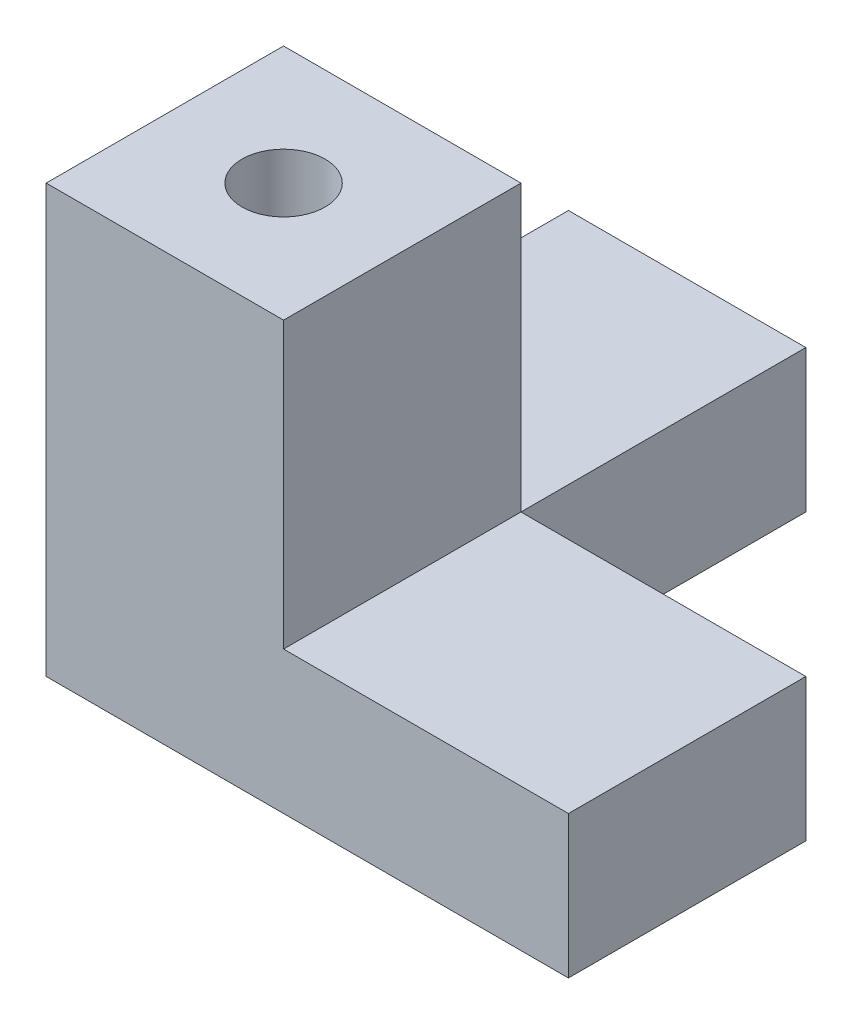
ISO-10303-21;
HEADER;
FILE_DESCRIPTION(('STEP AP214'),'2;1');
FILE_NAME('part.step','',(''),(''),'','','');
FILE_SCHEMA(('AUTOMOTIVE_DESIGN { 1 0 10303 214 1 1 1 1 }'));
ENDSEC;
DATA;
#1=APPLICATION_CONTEXT('core data for automotive mechanical design processes');
#2=APPLICATION_PROTOCOL_DEFINITION('international standard','automotive_design',2000,#1);
#3=PRODUCT_CONTEXT('',#1,'mechanical');
#4=PRODUCT('Part','Part','',(#3));
#5=PRODUCT_RELATED_PRODUCT_CATEGORY('part','',(#4));
#6=PRODUCT_DEFINITION_FORMATION('','',#4);
#7=PRODUCT_DEFINITION_CONTEXT('part definition',#1,'design');
#8=PRODUCT_DEFINITION('design','',#6,#7);
#9=PRODUCT_DEFINITION_SHAPE('','',#8);
#10=(LENGTH_UNIT() NAMED_UNIT(*) SI_UNIT(.MILLI.,.METRE.));
#11=(NAMED_UNIT(*) PLANE_ANGLE_UNIT() SI_UNIT($,.RADIAN.));
#12=(NAMED_UNIT(*) SI_UNIT($,.STERADIAN.) SOLID_ANGLE_UNIT());
#13=UNCERTAINTY_MEASURE_WITH_UNIT(LENGTH_MEASURE(1.E-05),#10,'distance_accuracy_value','');
#14=(GEOMETRIC_REPRESENTATION_CONTEXT(3) GLOBAL_UNCERTAINTY_ASSIGNED_CONTEXT((#13)) GLOBAL_UNIT_ASSIGNED_CONTEXT((#10,
#11,#12)) REPRESENTATION_CONTEXT('',''));
#15=CARTESIAN_POINT('',(0.,0.,0.));
#16=DIRECTION('',(0.,0.,1.));
#17=DIRECTION('',(1.,0.,0.));
#18=AXIS2_PLACEMENT_3D('',#15,#16,#17);
#19=CARTESIAN_POINT('',(5.,0.,-5.));
#20=DIRECTION('',(0.,1.,0.));
#21=DIRECTION('',(0.,0.,1.));
#22=AXIS2_PLACEMENT_3D('',#19,#20,#21);
#23=CYLINDRICAL_SURFACE('',#22,1.75);
#24=CARTESIAN_POINT('',(5.,18.,-5.));
#25=DIRECTION('',(0.,1.,0.));
#26=DIRECTION('',(0.,0.,1.));
#27=AXIS2_PLACEMENT_3D('',#24,#25,#26);
#28=CIRCLE('',#27,1.75);
#29=CARTESIAN_POINT('',(5.,18.,-3.25));
#30=VERTEX_POINT('',#29);
#31=EDGE_CURVE('E194',#30,#30,#28,.T.);
#32=ORIENTED_EDGE('',*,*,#31,.T.);
#33=EDGE_LOOP('',(#32));
#34=FACE_BOUND('',#33,.T.);
#35=CARTESIAN_POINT('',(5.,3.,-5.));
#36=DIRECTION('',(0.,-1.,0.));
#37=DIRECTION('',(0.,0.,-1.));
#38=AXIS2_PLACEMENT_3D('',#35,#36,#37);
#39=CIRCLE('',#38,1.75);
#40=CARTESIAN_POINT('',(5.,3.,-6.75));
#41=VERTEX_POINT('',#40);
#42=EDGE_CURVE('E37',#41,#41,#39,.F.);
#43=ORIENTED_EDGE('',*,*,#42,.F.);
#44=EDGE_LOOP('',(#43));
#45=FACE_BOUND('',#44,.T.);
#46=ADVANCED_FACE('F33',(#34,#45),#23,.F.);
#47=CARTESIAN_POINT('',(0.,6.,0.));
#48=DIRECTION('',(0.,-1.,0.));
#49=DIRECTION('',(0.,0.,-1.));
#50=AXIS2_PLACEMENT_3D('',#47,#48,#49);
#51=PLANE('',#50);
#52=DIRECTION('',(0.,0.,-1.));
#53=VECTOR('',#52,1.);
#54=CARTESIAN_POINT('',(10.,6.,-10.));
#55=LINE('',#54,#53);
#56=CARTESIAN_POINT('',(10.,6.,0.));
#57=VERTEX_POINT('',#56);
#58=CARTESIAN_POINT('',(10.,6.,-10.));
#59=VERTEX_POINT('',#58);
#60=EDGE_CURVE('E57',#57,#59,#55,.T.);
#61=ORIENTED_EDGE('',*,*,#60,.F.);
#62=DIRECTION('',(1.,0.,0.));
#63=VECTOR('',#62,1.);
#64=CARTESIAN_POINT('',(22.,6.,0.));
#65=LINE('',#64,#63);
#66=CARTESIAN_POINT('',(22.,6.,0.));
#67=VERTEX_POINT('',#66);
#68=EDGE_CURVE('E221',#57,#67,#65,.T.);
#69=ORIENTED_EDGE('',*,*,#68,.T.);
#70=DIRECTION('',(0.,0.,-1.));
#71=VECTOR('',#70,1.);
#72=CARTESIAN_POINT('',(22.,6.,-10.));
#73=LINE('',#72,#71);
#74=CARTESIAN_POINT('',(22.,6.,-10.));
#75=VERTEX_POINT('',#74);
#76=EDGE_CURVE('E223',#67,#75,#73,.T.);
#77=ORIENTED_EDGE('',*,*,#76,.T.);
#78=DIRECTION('',(-1.,0.,0.));
#79=VECTOR('',#78,1.);
#80=CARTESIAN_POINT('',(10.,6.,-10.));
#81=LINE('',#80,#79);
#82=EDGE_CURVE('E226',#75,#59,#81,.T.);
#83=ORIENTED_EDGE('',*,*,#82,.T.);
#84=EDGE_LOOP('',(#61,#69,#77,#83));
#85=FACE_BOUND('',#84,.T.);
#86=ADVANCED_FACE('F294',(#85),#51,.F.);
#87=DIRECTION('',(-1.,0.,0.));
#88=VECTOR('',#87,1.);
#89=CARTESIAN_POINT('',(10.,6.,-10.));
#90=LINE('',#89,#88);
#91=CARTESIAN_POINT('',(0.,6.,-10.));
#92=VERTEX_POINT('',#91);
#93=EDGE_CURVE('E201',#59,#92,#90,.T.);
#94=ORIENTED_EDGE('',*,*,#93,.F.);
#95=DIRECTION('',(0.,0.,-1.));
#96=VECTOR('',#95,1.);
#97=CARTESIAN_POINT('',(10.,6.,-22.));
#98=LINE('',#97,#96);
#99=CARTESIAN_POINT('',(10.,6.,-22.));
#100=VERTEX_POINT('',#99);
#101=EDGE_CURVE('E228',#59,#100,#98,.T.);
#102=ORIENTED_EDGE('',*,*,#101,.T.);
#103=DIRECTION('',(-1.,0.,0.));
#104=VECTOR('',#103,1.);
#105=CARTESIAN_POINT('',(0.,6.,-22.));
#106=LINE('',#105,#104);
#107=CARTESIAN_POINT('',(0.,6.,-22.));
#108=VERTEX_POINT('',#107);
#109=EDGE_CURVE('E230',#100,#108,#106,.T.);
#110=ORIENTED_EDGE('',*,*,#109,.T.);
#111=DIRECTION('',(0.,0.,1.));
#112=VECTOR('',#111,1.);
#113=CARTESIAN_POINT('',(0.,6.,0.));
#114=LINE('',#113,#112);
#115=EDGE_CURVE('E232',#108,#92,#114,.T.);
#116=ORIENTED_EDGE('',*,*,#115,.T.);
#117=EDGE_LOOP('',(#94,#102,#110,#116));
#118=FACE_BOUND('',#117,.T.);
#119=ADVANCED_FACE('F282',(#118),#51,.F.);
#120=CARTESIAN_POINT('',(22.,6.,0.));
#121=DIRECTION('',(0.,0.,-1.));
#122=DIRECTION('',(-1.,0.,0.));
#123=AXIS2_PLACEMENT_3D('',#120,#121,#122);
#124=PLANE('',#123);
#125=DIRECTION('',(1.,0.,0.));
#126=VECTOR('',#125,1.);
#127=CARTESIAN_POINT('',(22.,0.,0.));
#128=LINE('',#127,#126);
#129=CARTESIAN_POINT('',(0.,0.,0.));
#130=VERTEX_POINT('',#129);
#131=CARTESIAN_POINT('',(22.,0.,0.));
#132=VERTEX_POINT('',#131);
#133=EDGE_CURVE('E220',#130,#132,#128,.T.);
#134=ORIENTED_EDGE('',*,*,#133,.T.);
#135=DIRECTION('',(0.,-1.,0.));
#136=VECTOR('',#135,1.);
#137=CARTESIAN_POINT('',(22.,6.,0.));
#138=LINE('',#137,#136);
#139=EDGE_CURVE('E11',#67,#132,#138,.T.);
#140=ORIENTED_EDGE('',*,*,#139,.F.);
#141=ORIENTED_EDGE('',*,*,#68,.F.);
#142=DIRECTION('',(0.,-1.,0.));
#143=VECTOR('',#142,1.);
#144=CARTESIAN_POINT('',(10.,18.,0.));
#145=LINE('',#144,#143);
#146=CARTESIAN_POINT('',(10.,18.,0.));
#147=VERTEX_POINT('',#146);
#148=EDGE_CURVE('E208',#147,#57,#145,.T.);
#149=ORIENTED_EDGE('',*,*,#148,.F.);
#150=DIRECTION('',(1.,0.,0.));
#151=VECTOR('',#150,1.);
#152=CARTESIAN_POINT('',(10.,18.,0.));
#153=LINE('',#152,#151);
#154=CARTESIAN_POINT('',(0.,18.,0.));
#155=VERTEX_POINT('',#154);
#156=EDGE_CURVE('E206',#155,#147,#153,.T.);
#157=ORIENTED_EDGE('',*,*,#156,.F.);
#158=DIRECTION('',(0.,-1.,0.));
#159=VECTOR('',#158,1.);
#160=CARTESIAN_POINT('',(0.,6.,0.));
#161=LINE('',#160,#159);
#162=EDGE_CURVE('E234',#155,#130,#161,.T.);
#163=ORIENTED_EDGE('',*,*,#162,.T.);
#164=EDGE_LOOP('',(#134,#140,#141,#149,#157,#163));
#165=FACE_BOUND('',#164,.T.);
#166=ADVANCED_FACE('F35',(#165),#124,.F.);
#167=CARTESIAN_POINT('',(22.,6.,-10.));
#168=DIRECTION('',(-1.,0.,0.));
#169=DIRECTION('',(0.,0.,1.));
#170=AXIS2_PLACEMENT_3D('',#167,#168,#169);
#171=PLANE('',#170);
#172=DIRECTION('',(0.,0.,-1.));
#173=VECTOR('',#172,1.);
#174=CARTESIAN_POINT('',(22.,0.,-10.));
#175=LINE('',#174,#173);
#176=CARTESIAN_POINT('',(22.,0.,-10.));
#177=VERTEX_POINT('',#176);
#178=EDGE_CURVE('E237',#132,#177,#175,.T.);
#179=ORIENTED_EDGE('',*,*,#178,.T.);
#180=DIRECTION('',(0.,-1.,0.));
#181=VECTOR('',#180,1.);
#182=CARTESIAN_POINT('',(22.,6.,-10.));
#183=LINE('',#182,#181);
#184=EDGE_CURVE('E42',#75,#177,#183,.T.);
#185=ORIENTED_EDGE('',*,*,#184,.F.);
#186=ORIENTED_EDGE('',*,*,#76,.F.);
#187=ORIENTED_EDGE('',*,*,#139,.T.);
#188=EDGE_LOOP('',(#179,#185,#186,#187));
#189=FACE_BOUND('',#188,.T.);
#190=ADVANCED_FACE('F295',(#189),#171,.F.);
#191=CARTESIAN_POINT('',(10.,6.,-10.));
#192=DIRECTION('',(0.,0.,1.));
#193=DIRECTION('',(1.,0.,0.));
#194=AXIS2_PLACEMENT_3D('',#191,#192,#193);
#195=PLANE('',#194);
#196=DIRECTION('',(-1.,0.,0.));
#197=VECTOR('',#196,1.);
#198=CARTESIAN_POINT('',(10.,0.,-10.));
#199=LINE('',#198,#197);
#200=CARTESIAN_POINT('',(10.,0.,-10.));
#201=VERTEX_POINT('',#200);
#202=EDGE_CURVE('E239',#177,#201,#199,.T.);
#203=ORIENTED_EDGE('',*,*,#202,.T.);
#204=DIRECTION('',(0.,-1.,0.));
#205=VECTOR('',#204,1.);
#206=CARTESIAN_POINT('',(10.,6.,-10.));
#207=LINE('',#206,#205);
#208=EDGE_CURVE('E254',#59,#201,#207,.T.);
#209=ORIENTED_EDGE('',*,*,#208,.F.);
#210=ORIENTED_EDGE('',*,*,#82,.F.);
#211=ORIENTED_EDGE('',*,*,#184,.T.);
#212=EDGE_LOOP('',(#203,#209,#210,#211));
#213=FACE_BOUND('',#212,.T.);
#214=ADVANCED_FACE('F262',(#213),#195,.F.);
#215=CARTESIAN_POINT('',(10.,6.,-22.));
#216=DIRECTION('',(-1.,0.,0.));
#217=DIRECTION('',(0.,0.,1.));
#218=AXIS2_PLACEMENT_3D('',#215,#216,#217);
#219=PLANE('',#218);
#220=DIRECTION('',(0.,0.,-1.));
#221=VECTOR('',#220,1.);
#222=CARTESIAN_POINT('',(10.,0.,-22.));
#223=LINE('',#222,#221);
#224=CARTESIAN_POINT('',(10.,0.,-22.));
#225=VERTEX_POINT('',#224);
#226=EDGE_CURVE('E241',#201,#225,#223,.T.);
#227=ORIENTED_EDGE('',*,*,#226,.T.);
#228=DIRECTION('',(0.,-1.,0.));
#229=VECTOR('',#228,1.);
#230=CARTESIAN_POINT('',(10.,6.,-22.));
#231=LINE('',#230,#229);
#232=EDGE_CURVE('E251',#100,#225,#231,.T.);
#233=ORIENTED_EDGE('',*,*,#232,.F.);
#234=ORIENTED_EDGE('',*,*,#101,.F.);
#235=ORIENTED_EDGE('',*,*,#208,.T.);
#236=EDGE_LOOP('',(#227,#233,#234,#235));
#237=FACE_BOUND('',#236,.T.);
#238=ADVANCED_FACE('F274',(#237),#219,.F.);
#239=CARTESIAN_POINT('',(0.,6.,-22.));
#240=DIRECTION('',(0.,0.,1.));
#241=DIRECTION('',(1.,0.,0.));
#242=AXIS2_PLACEMENT_3D('',#239,#240,#241);
#243=PLANE('',#242);
#244=DIRECTION('',(-1.,0.,0.));
#245=VECTOR('',#244,1.);
#246=CARTESIAN_POINT('',(0.,0.,-22.));
#247=LINE('',#246,#245);
#248=CARTESIAN_POINT('',(0.,0.,-22.));
#249=VERTEX_POINT('',#248);
#250=EDGE_CURVE('E243',#225,#249,#247,.T.);
#251=ORIENTED_EDGE('',*,*,#250,.T.);
#252=DIRECTION('',(0.,-1.,0.));
#253=VECTOR('',#252,1.);
#254=CARTESIAN_POINT('',(0.,6.,-22.));
#255=LINE('',#254,#253);
#256=EDGE_CURVE('E248',#108,#249,#255,.T.);
#257=ORIENTED_EDGE('',*,*,#256,.F.);
#258=ORIENTED_EDGE('',*,*,#109,.F.);
#259=ORIENTED_EDGE('',*,*,#232,.T.);
#260=EDGE_LOOP('',(#251,#257,#258,#259));
#261=FACE_BOUND('',#260,.T.);
#262=ADVANCED_FACE('F278',(#261),#243,.F.);
#263=CARTESIAN_POINT('',(0.,6.,0.));
#264=DIRECTION('',(1.,0.,0.));
#265=DIRECTION('',(0.,0.,-1.));
#266=AXIS2_PLACEMENT_3D('',#263,#264,#265);
#267=PLANE('',#266);
#268=DIRECTION('',(0.,0.,1.));
#269=VECTOR('',#268,1.);
#270=CARTESIAN_POINT('',(0.,0.,0.));
#271=LINE('',#270,#269);
#272=EDGE_CURVE('E224',#249,#130,#271,.T.);
#273=ORIENTED_EDGE('',*,*,#272,.T.);
#274=ORIENTED_EDGE('',*,*,#162,.F.);
#275=DIRECTION('',(0.,0.,1.));
#276=VECTOR('',#275,1.);
#277=CARTESIAN_POINT('',(0.,18.,-10.));
#278=LINE('',#277,#276);
#279=CARTESIAN_POINT('',(0.,18.,-10.));
#280=VERTEX_POINT('',#279);
#281=EDGE_CURVE('E203',#280,#155,#278,.T.);
#282=ORIENTED_EDGE('',*,*,#281,.F.);
#283=DIRECTION('',(0.,-1.,0.));
#284=VECTOR('',#283,1.);
#285=CARTESIAN_POINT('',(0.,18.,-10.));
#286=LINE('',#285,#284);
#287=EDGE_CURVE('E214',#280,#92,#286,.T.);
#288=ORIENTED_EDGE('',*,*,#287,.T.);
#289=ORIENTED_EDGE('',*,*,#115,.F.);
#290=ORIENTED_EDGE('',*,*,#256,.T.);
#291=EDGE_LOOP('',(#273,#274,#282,#288,#289,#290));
#292=FACE_BOUND('',#291,.T.);
#293=ADVANCED_FACE('F297',(#292),#267,.F.);
#294=CARTESIAN_POINT('',(0.,0.,0.));
#295=DIRECTION('',(0.,-1.,0.));
#296=DIRECTION('',(0.,0.,-1.));
#297=AXIS2_PLACEMENT_3D('',#294,#295,#296);
#298=PLANE('',#297);
#299=DIRECTION('',(-0.5,0.,-0.866025403784439));
#300=VECTOR('',#299,1.);
#301=CARTESIAN_POINT('',(3.41228675972853,0.,-2.25));
#302=LINE('',#301,#300);
#303=CARTESIAN_POINT('',(3.41228675972853,0.,-2.25));
#304=VERTEX_POINT('',#303);
#305=CARTESIAN_POINT('',(1.82457351945706,0.,-5.));
#306=VERTEX_POINT('',#305);
#307=EDGE_CURVE('E49',#304,#306,#302,.T.);
#308=ORIENTED_EDGE('',*,*,#307,.F.);
#309=DIRECTION('',(-1.,0.,0.));
#310=VECTOR('',#309,1.);
#311=CARTESIAN_POINT('',(6.58771324027147,0.,-2.25));
#312=LINE('',#311,#310);
#313=CARTESIAN_POINT('',(6.58771324027147,0.,-2.25));
#314=VERTEX_POINT('',#313);
#315=EDGE_CURVE('E161',#314,#304,#312,.T.);
#316=ORIENTED_EDGE('',*,*,#315,.F.);
#317=DIRECTION('',(-0.5,0.,0.866025403784438));
#318=VECTOR('',#317,1.);
#319=CARTESIAN_POINT('',(8.17542648054294,0.,-5.));
#320=LINE('',#319,#318);
#321=CARTESIAN_POINT('',(8.17542648054294,0.,-5.));
#322=VERTEX_POINT('',#321);
#323=EDGE_CURVE('E164',#322,#314,#320,.T.);
#324=ORIENTED_EDGE('',*,*,#323,.F.);
#325=DIRECTION('',(0.5,0.,0.866025403784438));
#326=VECTOR('',#325,1.);
#327=CARTESIAN_POINT('',(6.58771324027147,0.,-7.75));
#328=LINE('',#327,#326);
#329=CARTESIAN_POINT('',(6.58771324027147,0.,-7.75));
#330=VERTEX_POINT('',#329);
#331=EDGE_CURVE('E180',#330,#322,#328,.T.);
#332=ORIENTED_EDGE('',*,*,#331,.F.);
#333=DIRECTION('',(1.,0.,0.));
#334=VECTOR('',#333,1.);
#335=CARTESIAN_POINT('',(3.41228675972853,0.,-7.75));
#336=LINE('',#335,#334);
#337=CARTESIAN_POINT('',(3.41228675972853,0.,-7.75));
#338=VERTEX_POINT('',#337);
#339=EDGE_CURVE('E177',#338,#330,#336,.T.);
#340=ORIENTED_EDGE('',*,*,#339,.F.);
#341=DIRECTION('',(0.5,0.,-0.866025403784438));
#342=VECTOR('',#341,1.);
#343=CARTESIAN_POINT('',(1.82457351945706,0.,-5.));
#344=LINE('',#343,#342);
#345=EDGE_CURVE('E175',#306,#338,#344,.T.);
#346=ORIENTED_EDGE('',*,*,#345,.F.);
#347=EDGE_LOOP('',(#308,#316,#324,#332,#340,#346));
#348=FACE_BOUND('',#347,.T.);
#349=ORIENTED_EDGE('',*,*,#133,.F.);
#350=ORIENTED_EDGE('',*,*,#272,.F.);
#351=ORIENTED_EDGE('',*,*,#250,.F.);
#352=ORIENTED_EDGE('',*,*,#226,.F.);
#353=ORIENTED_EDGE('',*,*,#202,.F.);
#354=ORIENTED_EDGE('',*,*,#178,.F.);
#355=EDGE_LOOP('',(#349,#350,#351,#352,#353,#354));
#356=FACE_BOUND('',#355,.T.);
#357=ADVANCED_FACE('F269',(#348,#356),#298,.T.);
#358=CARTESIAN_POINT('',(10.,18.,-10.));
#359=DIRECTION('',(-1.,0.,0.));
#360=DIRECTION('',(0.,0.,1.));
#361=AXIS2_PLACEMENT_3D('',#358,#359,#360);
#362=PLANE('',#361);
#363=ORIENTED_EDGE('',*,*,#60,.T.);
#364=DIRECTION('',(0.,-1.,0.));
#365=VECTOR('',#364,1.);
#366=CARTESIAN_POINT('',(10.,18.,-10.));
#367=LINE('',#366,#365);
#368=CARTESIAN_POINT('',(10.,18.,-10.));
#369=VERTEX_POINT('',#368);
#370=EDGE_CURVE('E217',#369,#59,#367,.T.);
#371=ORIENTED_EDGE('',*,*,#370,.F.);
#372=DIRECTION('',(0.,0.,-1.));
#373=VECTOR('',#372,1.);
#374=CARTESIAN_POINT('',(10.,18.,-10.));
#375=LINE('',#374,#373);
#376=EDGE_CURVE('E197',#147,#369,#375,.T.);
#377=ORIENTED_EDGE('',*,*,#376,.F.);
#378=ORIENTED_EDGE('',*,*,#148,.T.);
#379=EDGE_LOOP('',(#363,#371,#377,#378));
#380=FACE_BOUND('',#379,.T.);
#381=ADVANCED_FACE('F289',(#380),#362,.F.);
#382=CARTESIAN_POINT('',(10.,18.,-10.));
#383=DIRECTION('',(0.,0.,1.));
#384=DIRECTION('',(1.,0.,0.));
#385=AXIS2_PLACEMENT_3D('',#382,#383,#384);
#386=PLANE('',#385);
#387=ORIENTED_EDGE('',*,*,#93,.T.);
#388=ORIENTED_EDGE('',*,*,#287,.F.);
#389=DIRECTION('',(-1.,0.,0.));
#390=VECTOR('',#389,1.);
#391=CARTESIAN_POINT('',(10.,18.,-10.));
#392=LINE('',#391,#390);
#393=EDGE_CURVE('E200',#369,#280,#392,.T.);
#394=ORIENTED_EDGE('',*,*,#393,.F.);
#395=ORIENTED_EDGE('',*,*,#370,.T.);
#396=EDGE_LOOP('',(#387,#388,#394,#395));
#397=FACE_BOUND('',#396,.T.);
#398=ADVANCED_FACE('F285',(#397),#386,.F.);
#399=CARTESIAN_POINT('',(0.,18.,0.));
#400=DIRECTION('',(0.,-1.,0.));
#401=DIRECTION('',(0.,0.,-1.));
#402=AXIS2_PLACEMENT_3D('',#399,#400,#401);
#403=PLANE('',#402);
#404=ORIENTED_EDGE('',*,*,#31,.F.);
#405=EDGE_LOOP('',(#404));
#406=FACE_BOUND('',#405,.T.);
#407=ORIENTED_EDGE('',*,*,#376,.T.);
#408=ORIENTED_EDGE('',*,*,#393,.T.);
#409=ORIENTED_EDGE('',*,*,#281,.T.);
#410=ORIENTED_EDGE('',*,*,#156,.T.);
#411=EDGE_LOOP('',(#407,#408,#409,#410));
#412=FACE_BOUND('',#411,.T.);
#413=ADVANCED_FACE('F300',(#406,#412),#403,.F.);
#414=CARTESIAN_POINT('',(0.,3.,0.));
#415=DIRECTION('',(0.,-1.,0.));
#416=DIRECTION('',(0.,0.,-1.));
#417=AXIS2_PLACEMENT_3D('',#414,#415,#416);
#418=PLANE('',#417);
#419=DIRECTION('',(-0.5,0.,-0.866025403784439));
#420=VECTOR('',#419,1.);
#421=CARTESIAN_POINT('',(3.41228675972853,3.,-2.25));
#422=LINE('',#421,#420);
#423=CARTESIAN_POINT('',(3.41228675972853,3.,-2.25));
#424=VERTEX_POINT('',#423);
#425=CARTESIAN_POINT('',(1.82457351945706,3.,-5.));
#426=VERTEX_POINT('',#425);
#427=EDGE_CURVE('E141',#424,#426,#422,.T.);
#428=ORIENTED_EDGE('',*,*,#427,.T.);
#429=DIRECTION('',(0.5,0.,-0.866025403784438));
#430=VECTOR('',#429,1.);
#431=CARTESIAN_POINT('',(1.82457351945706,3.,-5.));
#432=LINE('',#431,#430);
#433=CARTESIAN_POINT('',(3.41228675972853,3.,-7.75));
#434=VERTEX_POINT('',#433);
#435=EDGE_CURVE('E150',#426,#434,#432,.T.);
#436=ORIENTED_EDGE('',*,*,#435,.T.);
#437=DIRECTION('',(1.,0.,0.));
#438=VECTOR('',#437,1.);
#439=CARTESIAN_POINT('',(3.41228675972853,3.,-7.75));
#440=LINE('',#439,#438);
#441=CARTESIAN_POINT('',(6.58771324027147,3.,-7.75));
#442=VERTEX_POINT('',#441);
#443=EDGE_CURVE('E155',#434,#442,#440,.T.);
#444=ORIENTED_EDGE('',*,*,#443,.T.);
#445=DIRECTION('',(0.5,0.,0.866025403784438));
#446=VECTOR('',#445,1.);
#447=CARTESIAN_POINT('',(6.58771324027147,3.,-7.75));
#448=LINE('',#447,#446);
#449=CARTESIAN_POINT('',(8.17542648054294,3.,-5.));
#450=VERTEX_POINT('',#449);
#451=EDGE_CURVE('E168',#442,#450,#448,.T.);
#452=ORIENTED_EDGE('',*,*,#451,.T.);
#453=DIRECTION('',(-0.5,0.,0.866025403784438));
#454=VECTOR('',#453,1.);
#455=CARTESIAN_POINT('',(8.17542648054294,3.,-5.));
#456=LINE('',#455,#454);
#457=CARTESIAN_POINT('',(6.58771324027147,3.,-2.25));
#458=VERTEX_POINT('',#457);
#459=EDGE_CURVE('E171',#450,#458,#456,.T.);
#460=ORIENTED_EDGE('',*,*,#459,.T.);
#461=DIRECTION('',(-1.,0.,0.));
#462=VECTOR('',#461,1.);
#463=CARTESIAN_POINT('',(6.58771324027147,3.,-2.25));
#464=LINE('',#463,#462);
#465=EDGE_CURVE('E147',#458,#424,#464,.T.);
#466=ORIENTED_EDGE('',*,*,#465,.T.);
#467=EDGE_LOOP('',(#428,#436,#444,#452,#460,#466));
#468=FACE_BOUND('',#467,.T.);
#469=ORIENTED_EDGE('',*,*,#42,.T.);
#470=EDGE_LOOP('',(#469));
#471=FACE_BOUND('',#470,.T.);
#472=ADVANCED_FACE('F157',(#468,#471),#418,.T.);
#473=CARTESIAN_POINT('',(3.41228675972853,3.,-2.25));
#474=DIRECTION('',(-0.866025403784439,0.,0.5));
#475=DIRECTION('',(0.5,0.,0.866025403784439));
#476=AXIS2_PLACEMENT_3D('',#473,#474,#475);
#477=PLANE('',#476);
#478=ORIENTED_EDGE('',*,*,#307,.T.);
#479=DIRECTION('',(0.,-1.,0.));
#480=VECTOR('',#479,1.);
#481=CARTESIAN_POINT('',(1.82457351945706,3.,-5.));
#482=LINE('',#481,#480);
#483=EDGE_CURVE('E137',#426,#306,#482,.T.);
#484=ORIENTED_EDGE('',*,*,#483,.F.);
#485=ORIENTED_EDGE('',*,*,#427,.F.);
#486=DIRECTION('',(0.,-1.,0.));
#487=VECTOR('',#486,1.);
#488=CARTESIAN_POINT('',(3.41228675972853,3.,-2.25));
#489=LINE('',#488,#487);
#490=EDGE_CURVE('E185',#424,#304,#489,.T.);
#491=ORIENTED_EDGE('',*,*,#490,.T.);
#492=EDGE_LOOP('',(#478,#484,#485,#491));
#493=FACE_BOUND('',#492,.T.);
#494=ADVANCED_FACE('F139',(#493),#477,.F.);
#495=CARTESIAN_POINT('',(6.58771324027147,3.,-2.25));
#496=DIRECTION('',(0.,0.,1.));
#497=DIRECTION('',(1.,0.,0.));
#498=AXIS2_PLACEMENT_3D('',#495,#496,#497);
#499=PLANE('',#498);
#500=ORIENTED_EDGE('',*,*,#315,.T.);
#501=ORIENTED_EDGE('',*,*,#490,.F.);
#502=ORIENTED_EDGE('',*,*,#465,.F.);
#503=DIRECTION('',(0.,-1.,0.));
#504=VECTOR('',#503,1.);
#505=CARTESIAN_POINT('',(6.58771324027147,3.,-2.25));
#506=LINE('',#505,#504);
#507=EDGE_CURVE('E187',#458,#314,#506,.T.);
#508=ORIENTED_EDGE('',*,*,#507,.T.);
#509=EDGE_LOOP('',(#500,#501,#502,#508));
#510=FACE_BOUND('',#509,.T.);
#511=ADVANCED_FACE('F322',(#510),#499,.F.);
#512=CARTESIAN_POINT('',(8.17542648054294,3.,-5.));
#513=DIRECTION('',(0.866025403784439,0.,0.5));
#514=DIRECTION('',(0.5,0.,-0.866025403784439));
#515=AXIS2_PLACEMENT_3D('',#512,#513,#514);
#516=PLANE('',#515);
#517=ORIENTED_EDGE('',*,*,#323,.T.);
#518=ORIENTED_EDGE('',*,*,#507,.F.);
#519=ORIENTED_EDGE('',*,*,#459,.F.);
#520=DIRECTION('',(0.,-1.,0.));
#521=VECTOR('',#520,1.);
#522=CARTESIAN_POINT('',(8.17542648054294,3.,-5.));
#523=LINE('',#522,#521);
#524=EDGE_CURVE('E189',#450,#322,#523,.T.);
#525=ORIENTED_EDGE('',*,*,#524,.T.);
#526=EDGE_LOOP('',(#517,#518,#519,#525));
#527=FACE_BOUND('',#526,.T.);
#528=ADVANCED_FACE('F332',(#527),#516,.F.);
#529=CARTESIAN_POINT('',(6.58771324027147,3.,-7.75));
#530=DIRECTION('',(0.866025403784439,0.,-0.5));
#531=DIRECTION('',(-0.5,0.,-0.866025403784439));
#532=AXIS2_PLACEMENT_3D('',#529,#530,#531);
#533=PLANE('',#532);
#534=ORIENTED_EDGE('',*,*,#331,.T.);
#535=ORIENTED_EDGE('',*,*,#524,.F.);
#536=ORIENTED_EDGE('',*,*,#451,.F.);
#537=DIRECTION('',(0.,-1.,0.));
#538=VECTOR('',#537,1.);
#539=CARTESIAN_POINT('',(6.58771324027147,3.,-7.75));
#540=LINE('',#539,#538);
#541=EDGE_CURVE('E191',#442,#330,#540,.T.);
#542=ORIENTED_EDGE('',*,*,#541,.T.);
#543=EDGE_LOOP('',(#534,#535,#536,#542));
#544=FACE_BOUND('',#543,.T.);
#545=ADVANCED_FACE('F328',(#544),#533,.F.);
#546=CARTESIAN_POINT('',(3.41228675972853,3.,-7.75));
#547=DIRECTION('',(0.,0.,-1.));
#548=DIRECTION('',(-1.,0.,0.));
#549=AXIS2_PLACEMENT_3D('',#546,#547,#548);
#550=PLANE('',#549);
#551=ORIENTED_EDGE('',*,*,#339,.T.);
#552=ORIENTED_EDGE('',*,*,#541,.F.);
#553=ORIENTED_EDGE('',*,*,#443,.F.);
#554=DIRECTION('',(0.,-1.,0.));
#555=VECTOR('',#554,1.);
#556=CARTESIAN_POINT('',(3.41228675972853,3.,-7.75));
#557=LINE('',#556,#555);
#558=EDGE_CURVE('E146',#434,#338,#557,.T.);
#559=ORIENTED_EDGE('',*,*,#558,.T.);
#560=EDGE_LOOP('',(#551,#552,#553,#559));
#561=FACE_BOUND('',#560,.T.);
#562=ADVANCED_FACE('F325',(#561),#550,.F.);
#563=CARTESIAN_POINT('',(1.82457351945706,3.,-5.));
#564=DIRECTION('',(-0.866025403784439,0.,-0.5));
#565=DIRECTION('',(-0.5,0.,0.866025403784439));
#566=AXIS2_PLACEMENT_3D('',#563,#564,#565);
#567=PLANE('',#566);
#568=ORIENTED_EDGE('',*,*,#345,.T.);
#569=ORIENTED_EDGE('',*,*,#558,.F.);
#570=ORIENTED_EDGE('',*,*,#435,.F.);
#571=ORIENTED_EDGE('',*,*,#483,.T.);
#572=EDGE_LOOP('',(#568,#569,#570,#571));
#573=FACE_BOUND('',#572,.T.);
#574=ADVANCED_FACE('F151',(#573),#567,.F.);
#575=CLOSED_SHELL('',(#46,#86,#119,#166,#190,#214,#238,#262,#293,#357,#381,#398,#413,#472,#494,
#511,#528,#545,#562,#574));
#576=MANIFOLD_SOLID_BREP('B2',#575);
#577=ADVANCED_BREP_SHAPE_REPRESENTATION('',(#18,#576),#14);
#578=SHAPE_DEFINITION_REPRESENTATION(#9,#577);
ENDSEC;
END-ISO-10303-21;
